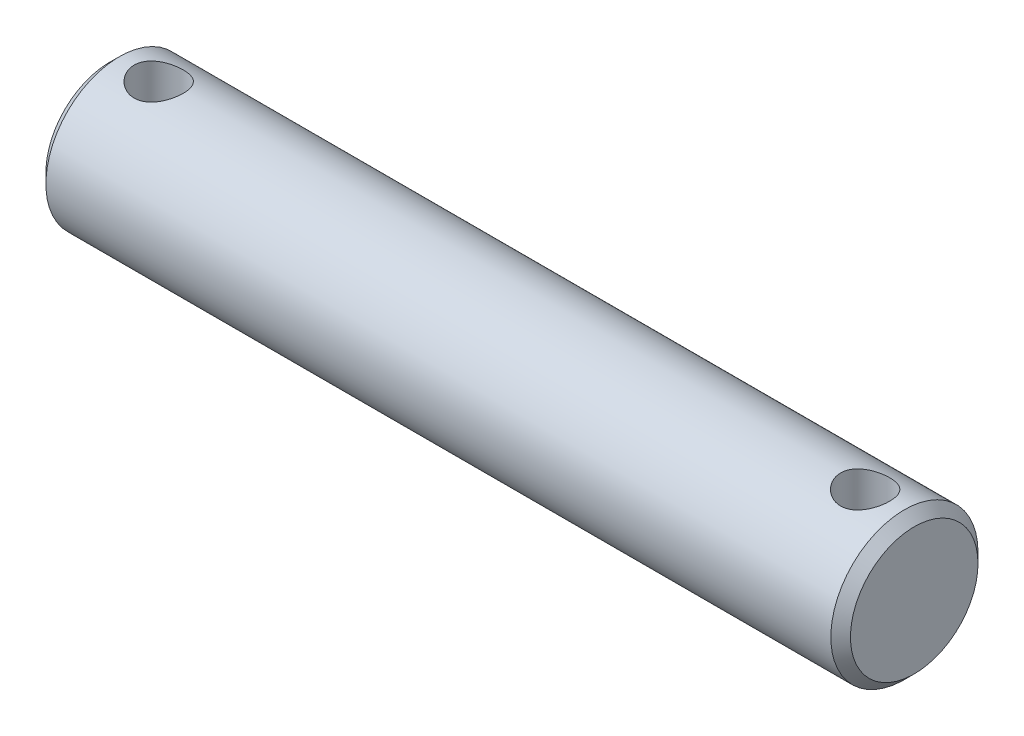
ISO-10303-21;
HEADER;
FILE_DESCRIPTION(('STEP AP214'),'2;1');
FILE_NAME('part.step','',(''),(''),'','','');
FILE_SCHEMA(('AUTOMOTIVE_DESIGN { 1 0 10303 214 1 1 1 1 }'));
ENDSEC;
DATA;
#1=APPLICATION_CONTEXT('core data for automotive mechanical design processes');
#2=APPLICATION_PROTOCOL_DEFINITION('international standard','automotive_design',2000,#1);
#3=PRODUCT_CONTEXT('',#1,'mechanical');
#4=PRODUCT('Part','Part','',(#3));
#5=PRODUCT_RELATED_PRODUCT_CATEGORY('part','',(#4));
#6=PRODUCT_DEFINITION_FORMATION('','',#4);
#7=PRODUCT_DEFINITION_CONTEXT('part definition',#1,'design');
#8=PRODUCT_DEFINITION('design','',#6,#7);
#9=PRODUCT_DEFINITION_SHAPE('','',#8);
#10=(LENGTH_UNIT() NAMED_UNIT(*) SI_UNIT(.MILLI.,.METRE.));
#11=(NAMED_UNIT(*) PLANE_ANGLE_UNIT() SI_UNIT($,.RADIAN.));
#12=(NAMED_UNIT(*) SI_UNIT($,.STERADIAN.) SOLID_ANGLE_UNIT());
#13=UNCERTAINTY_MEASURE_WITH_UNIT(LENGTH_MEASURE(1.E-05),#10,'distance_accuracy_value','');
#14=(GEOMETRIC_REPRESENTATION_CONTEXT(3) GLOBAL_UNCERTAINTY_ASSIGNED_CONTEXT((#13)) GLOBAL_UNIT_ASSIGNED_CONTEXT((#10,
#11,#12)) REPRESENTATION_CONTEXT('',''));
#15=CARTESIAN_POINT('',(0.,0.,0.));
#16=DIRECTION('',(0.,0.,1.));
#17=DIRECTION('',(1.,0.,0.));
#18=AXIS2_PLACEMENT_3D('',#15,#16,#17);
#19=CARTESIAN_POINT('',(-41.,0.,0.));
#20=DIRECTION('',(1.,0.,0.));
#21=DIRECTION('',(0.,0.,-1.));
#22=AXIS2_PLACEMENT_3D('',#19,#20,#21);
#23=CYLINDRICAL_SURFACE('',#22,7.5);
#24=CARTESIAN_POINT('',(40.,0.,0.));
#25=DIRECTION('',(1.,0.,0.));
#26=DIRECTION('',(0.,0.,-1.));
#27=AXIS2_PLACEMENT_3D('',#24,#25,#26);
#28=CIRCLE('',#27,7.5);
#29=CARTESIAN_POINT('',(40.,0.,-7.5));
#30=VERTEX_POINT('',#29);
#31=EDGE_CURVE('E38',#30,#30,#28,.F.);
#32=ORIENTED_EDGE('',*,*,#31,.T.);
#33=EDGE_LOOP('',(#32));
#34=FACE_BOUND('',#33,.T.);
#35=CARTESIAN_POINT('',(-40.,0.,0.));
#36=DIRECTION('',(1.,0.,0.));
#37=DIRECTION('',(0.,0.,-1.));
#38=AXIS2_PLACEMENT_3D('',#35,#36,#37);
#39=CIRCLE('',#38,7.5);
#40=CARTESIAN_POINT('',(-40.,0.,-7.5));
#41=VERTEX_POINT('',#40);
#42=EDGE_CURVE('E42',#41,#41,#39,.T.);
#43=ORIENTED_EDGE('',*,*,#42,.T.);
#44=EDGE_LOOP('',(#43));
#45=FACE_BOUND('',#44,.T.);
#46=CARTESIAN_POINT('',(36.,-7.07106781186547,2.5));
#47=CARTESIAN_POINT('',(36.1361704370902,-7.07106736326085,2.50000064486928));
#48=CARTESIAN_POINT('',(36.272336999559,-7.07504423227143,2.48883695921381));
#49=CARTESIAN_POINT('',(36.5406360524856,-7.09043935203137,2.44462782922202));
#50=CARTESIAN_POINT('',(36.6727678746812,-7.10185882855472,2.41157878042099));
#51=CARTESIAN_POINT('',(36.9290672324932,-7.13070509221979,2.32488871421226));
#52=CARTESIAN_POINT('',(37.0532498236068,-7.14812009928304,2.27128805350812));
#53=CARTESIAN_POINT('',(37.2909001213699,-7.18697805025812,2.14515407110345));
#54=CARTESIAN_POINT('',(37.4043654563841,-7.20842188259031,2.07261657215046));
#55=CARTESIAN_POINT('',(37.6217999058458,-7.25386223518683,1.9076278661072));
#56=CARTESIAN_POINT('',(37.7252885716793,-7.2779223711161,1.8145608534448));
#57=CARTESIAN_POINT('',(37.9155170030616,-7.32534662002507,1.61246916803599));
#58=CARTESIAN_POINT('',(38.0022540789559,-7.34871062072404,1.50344193763094));
#59=CARTESIAN_POINT('',(38.158697243324,-7.39284667304497,1.26901126991253));
#60=CARTESIAN_POINT('',(38.2278999265449,-7.41353519254014,1.14325477806131));
#61=CARTESIAN_POINT('',(38.3439789628188,-7.44923966927457,0.881078057468687));
#62=CARTESIAN_POINT('',(38.3908613329423,-7.46425715507505,0.744660714218033));
#63=CARTESIAN_POINT('',(38.459339636581,-7.48647688579767,0.470072043583739));
#64=CARTESIAN_POINT('',(38.4817586156425,-7.49393286943898,0.332126887132425));
#65=CARTESIAN_POINT('',(38.5032907334017,-7.5010902054562,0.0542446870602269));
#66=CARTESIAN_POINT('',(38.502409879131,-7.50079355657239,-0.085691833859738));
#67=CARTESIAN_POINT('',(38.4778893635849,-7.49265099046828,-0.357758787984534));
#68=CARTESIAN_POINT('',(38.4551436788138,-7.48510161887793,-0.489980121479139));
#69=CARTESIAN_POINT('',(38.3890175475488,-7.46367418349329,-0.748608597055427));
#70=CARTESIAN_POINT('',(38.3456357025504,-7.44979569077954,-0.875015344448038));
#71=CARTESIAN_POINT('',(38.2389467067349,-7.41689175733061,-1.12038118710493));
#72=CARTESIAN_POINT('',(38.1753851536337,-7.39780106310039,-1.23922055242211));
#73=CARTESIAN_POINT('',(38.0303507363784,-7.35645982597298,-1.46481081381831));
#74=CARTESIAN_POINT('',(37.9488728916809,-7.33420840503667,-1.57155833596335));
#75=CARTESIAN_POINT('',(37.7658140163508,-7.28765479624741,-1.77525216637827));
#76=CARTESIAN_POINT('',(37.6634671053963,-7.26330537922194,-1.87150039266318));
#77=CARTESIAN_POINT('',(37.4438781856835,-7.21618338122252,-2.04569314899543));
#78=CARTESIAN_POINT('',(37.3266338856799,-7.19341104364038,-2.12363485820386));
#79=CARTESIAN_POINT('',(37.0783659359914,-7.15176312802781,-2.25996863758936));
#80=CARTESIAN_POINT('',(36.9471696717056,-7.1329477321187,-2.31806615905335));
#81=CARTESIAN_POINT('',(36.676071514464,-7.10204127060962,-2.41110798317334));
#82=CARTESIAN_POINT('',(36.5361732969844,-7.08994738717732,-2.44606198936873));
#83=CARTESIAN_POINT('',(36.2584041114711,-7.07449090788963,-2.49040320524381));
#84=CARTESIAN_POINT('',(36.1207264381284,-7.0707590079689,-2.50087273876908));
#85=CARTESIAN_POINT('',(35.8455596272147,-7.07141680147961,-2.4990135972743));
#86=CARTESIAN_POINT('',(35.70807045994,-7.07580501979536,-2.48668906306691));
#87=CARTESIAN_POINT('',(35.4421075857202,-7.09184045225748,-2.44056412888078));
#88=CARTESIAN_POINT('',(35.3134864246229,-7.10323313602101,-2.40751598495171));
#89=CARTESIAN_POINT('',(35.063640984402,-7.13171384177557,-2.32178465640117));
#90=CARTESIAN_POINT('',(34.9424180210231,-7.14880287337099,-2.26909799090856));
#91=CARTESIAN_POINT('',(34.7065489478825,-7.18742193989467,-2.14368585184734));
#92=CARTESIAN_POINT('',(34.5922333933955,-7.20907564164071,-2.07037779589624));
#93=CARTESIAN_POINT('',(34.3771348690407,-7.25414421827413,-1.9064640763939));
#94=CARTESIAN_POINT('',(34.276355903347,-7.27755961109486,-1.81585331374696));
#95=CARTESIAN_POINT('',(34.0861800397734,-7.32487596594622,-1.61472926475082));
#96=CARTESIAN_POINT('',(33.9975640249529,-7.34874608944741,-1.50346817636663));
#97=CARTESIAN_POINT('',(33.8402096441299,-7.39317129032772,-1.26706822850065));
#98=CARTESIAN_POINT('',(33.7714705720939,-7.41372648544237,-1.14192986216138));
#99=CARTESIAN_POINT('',(33.6564497378457,-7.44911014526507,-0.881949656080743));
#100=CARTESIAN_POINT('',(33.6100218071298,-7.46397575011328,-0.747177808302994));
#101=CARTESIAN_POINT('',(33.5406806448497,-7.48646527094436,-0.471146164615044));
#102=CARTESIAN_POINT('',(33.5177589252988,-7.49409180085047,-0.329888729884728));
#103=CARTESIAN_POINT('',(33.4968448059859,-7.50104658090641,-0.0520383396501075));
#104=CARTESIAN_POINT('',(33.4977313651691,-7.50074800223598,0.0844618098000421));
#105=CARTESIAN_POINT('',(33.521643270366,-7.49280491298495,0.355277862500432));
#106=CARTESIAN_POINT('',(33.5446668203819,-7.48516099833939,0.489593942047639));
#107=CARTESIAN_POINT('',(33.6114555864399,-7.46352287386031,0.750105298580145));
#108=CARTESIAN_POINT('',(33.6548855383823,-7.44963145902871,0.876395677281971));
#109=CARTESIAN_POINT('',(33.7609438277429,-7.41692901761237,1.11994587734949));
#110=CARTESIAN_POINT('',(33.8235756379925,-7.39811710120041,1.23720406035608));
#111=CARTESIAN_POINT('',(33.968923780255,-7.35664672069702,1.46408504077196));
#112=CARTESIAN_POINT('',(34.0522967134541,-7.33387181229816,1.57326562889402));
#113=CARTESIAN_POINT('',(34.2356434778905,-7.28732471979699,1.77645256568107));
#114=CARTESIAN_POINT('',(34.3356226056568,-7.26355221932743,1.87045405406148));
#115=CARTESIAN_POINT('',(34.5540233889674,-7.21658199563995,2.04435452208279));
#116=CARTESIAN_POINT('',(34.6730137774416,-7.19344319971577,2.12355741499475));
#117=CARTESIAN_POINT('',(34.9233360672569,-7.15150483307538,2.26078585825279));
#118=CARTESIAN_POINT('',(35.0546647325742,-7.13270412903123,2.31881694204869));
#119=CARTESIAN_POINT('',(35.3199045600391,-7.10253335516286,2.40960957051041));
#120=CARTESIAN_POINT('',(35.4534306588134,-7.09086582142956,2.4433947728738));
#121=CARTESIAN_POINT('',(35.7246401261668,-7.07513458848795,2.48858580037317));
#122=CARTESIAN_POINT('',(35.8623220435268,-7.07106826543653,2.49999934799148));
#123=CARTESIAN_POINT('',(36.,-7.07106781186547,2.5));
#124=B_SPLINE_CURVE_WITH_KNOTS('',3,(#46,#47,#48,#49,#50,#51,#52,#53,#54,#55,#56,#57,#58,#59,
#60,#61,#62,#63,#64,#65,#66,#67,#68,#69,#70,#71,#72,#73,#74,#75,#76,#77,#78,#79,#80,#81,#82,#83,
#84,#85,#86,#87,#88,#89,#90,#91,#92,#93,#94,#95,#96,#97,#98,#99,#100,#101,#102,#103,#104,#105,
#106,#107,#108,#109,#110,#111,#112,#113,#114,#115,#116,#117,#118,#119,#120,#121,#122,#123),
.UNSPECIFIED.,.T.,.F.,(4,2,2,2,2,2,2,2,2,2,2,2,2,2,2,2,2,2,2,2,2,2,2,2,2,2,2,2,2,2,2,2,2,2,2,2,
2,2,4),(0.,0.408001461998397,0.816070137537908,1.22334156875207,1.6307029154636,2.0525334356892,
2.4744316292997,2.90733765359143,3.34012690966972,3.75785796912336,4.17548133255818,
4.57672512063923,4.97799610473092,5.38454137150838,5.79119979685055,6.21700435909794,
6.64287449030265,7.07481599607639,7.50657628391539,7.91885728411098,8.33106339593085,
8.72910989421941,9.12722697867365,9.53797144339288,9.94883714155319,10.3794702042773,
10.8100879689383,11.2378447797713,11.6654470751039,12.0729521169409,12.4804241002445,
12.8814239010108,13.2824962690811,13.6983879880159,14.1144126108158,14.5467225684036,
14.9789194566717,15.3915803040673,15.8040986797616),.UNSPECIFIED.);
#125=CARTESIAN_POINT('',(36.,-7.07106781186547,2.5));
#126=VERTEX_POINT('',#125);
#127=EDGE_CURVE('E84',#126,#126,#124,.T.);
#128=ORIENTED_EDGE('',*,*,#127,.T.);
#129=EDGE_LOOP('',(#128));
#130=FACE_BOUND('',#129,.T.);
#131=CARTESIAN_POINT('',(-36.,-7.07106781186547,2.5));
#132=CARTESIAN_POINT('',(-35.8638295629098,-7.07106736326085,2.50000064486928));
#133=CARTESIAN_POINT('',(-35.727663000441,-7.07504423227143,2.48883695921381));
#134=CARTESIAN_POINT('',(-35.4593639475144,-7.09043935203137,2.44462782922202));
#135=CARTESIAN_POINT('',(-35.3272321253188,-7.10185882855472,2.41157878042099));
#136=CARTESIAN_POINT('',(-35.0709327675068,-7.13070509221979,2.32488871421226));
#137=CARTESIAN_POINT('',(-34.9467501763932,-7.14812009928304,2.27128805350812));
#138=CARTESIAN_POINT('',(-34.7090998786301,-7.18697805025812,2.14515407110345));
#139=CARTESIAN_POINT('',(-34.5956345436159,-7.20842188259031,2.07261657215046));
#140=CARTESIAN_POINT('',(-34.3782000941542,-7.25386223518683,1.9076278661072));
#141=CARTESIAN_POINT('',(-34.2747114283207,-7.2779223711161,1.8145608534448));
#142=CARTESIAN_POINT('',(-34.0844829969384,-7.32534662002507,1.61246916803599));
#143=CARTESIAN_POINT('',(-33.9977459210441,-7.34871062072404,1.50344193763094));
#144=CARTESIAN_POINT('',(-33.841302756676,-7.39284667304497,1.26901126991253));
#145=CARTESIAN_POINT('',(-33.7721000734551,-7.41353519254014,1.14325477806131));
#146=CARTESIAN_POINT('',(-33.6560210371812,-7.44923966927457,0.881078057468687));
#147=CARTESIAN_POINT('',(-33.6091386670577,-7.46425715507505,0.744660714218033));
#148=CARTESIAN_POINT('',(-33.540660363419,-7.48647688579767,0.470072043583739));
#149=CARTESIAN_POINT('',(-33.5182413843575,-7.49393286943898,0.332126887132425));
#150=CARTESIAN_POINT('',(-33.4967092665984,-7.5010902054562,0.0542446870602269));
#151=CARTESIAN_POINT('',(-33.497590120869,-7.50079355657239,-0.085691833859738));
#152=CARTESIAN_POINT('',(-33.5221106364151,-7.49265099046828,-0.357758787984534));
#153=CARTESIAN_POINT('',(-33.5448563211862,-7.48510161887793,-0.489980121479139));
#154=CARTESIAN_POINT('',(-33.6109824524512,-7.46367418349329,-0.748608597055427));
#155=CARTESIAN_POINT('',(-33.6543642974496,-7.44979569077954,-0.875015344448038));
#156=CARTESIAN_POINT('',(-33.7610532932651,-7.41689175733061,-1.12038118710493));
#157=CARTESIAN_POINT('',(-33.8246148463663,-7.39780106310039,-1.23922055242211));
#158=CARTESIAN_POINT('',(-33.9696492636216,-7.35645982597298,-1.46481081381831));
#159=CARTESIAN_POINT('',(-34.0511271083191,-7.33420840503667,-1.57155833596335));
#160=CARTESIAN_POINT('',(-34.2341859836492,-7.28765479624741,-1.77525216637827));
#161=CARTESIAN_POINT('',(-34.3365328946037,-7.26330537922194,-1.87150039266318));
#162=CARTESIAN_POINT('',(-34.5561218143165,-7.21618338122252,-2.04569314899543));
#163=CARTESIAN_POINT('',(-34.6733661143201,-7.19341104364038,-2.12363485820386));
#164=CARTESIAN_POINT('',(-34.9216340640086,-7.15176312802781,-2.25996863758936));
#165=CARTESIAN_POINT('',(-35.0528303282944,-7.1329477321187,-2.31806615905335));
#166=CARTESIAN_POINT('',(-35.323928485536,-7.10204127060962,-2.41110798317334));
#167=CARTESIAN_POINT('',(-35.4638267030156,-7.08994738717732,-2.44606198936873));
#168=CARTESIAN_POINT('',(-35.7415958885289,-7.07449090788963,-2.49040320524381));
#169=CARTESIAN_POINT('',(-35.8792735618716,-7.0707590079689,-2.50087273876908));
#170=CARTESIAN_POINT('',(-36.1544403727853,-7.07141680147961,-2.4990135972743));
#171=CARTESIAN_POINT('',(-36.29192954006,-7.07580501979536,-2.48668906306691));
#172=CARTESIAN_POINT('',(-36.5578924142798,-7.09184045225748,-2.44056412888078));
#173=CARTESIAN_POINT('',(-36.6865135753771,-7.10323313602101,-2.40751598495171));
#174=CARTESIAN_POINT('',(-36.936359015598,-7.13171384177557,-2.32178465640117));
#175=CARTESIAN_POINT('',(-37.057581978977,-7.14880287337099,-2.26909799090856));
#176=CARTESIAN_POINT('',(-37.2934510521175,-7.18742193989467,-2.14368585184734));
#177=CARTESIAN_POINT('',(-37.4077666066045,-7.20907564164071,-2.07037779589624));
#178=CARTESIAN_POINT('',(-37.6228651309593,-7.25414421827413,-1.9064640763939));
#179=CARTESIAN_POINT('',(-37.7236440966531,-7.27755961109486,-1.81585331374696));
#180=CARTESIAN_POINT('',(-37.9138199602266,-7.32487596594622,-1.61472926475082));
#181=CARTESIAN_POINT('',(-38.0024359750471,-7.34874608944741,-1.50346817636663));
#182=CARTESIAN_POINT('',(-38.1597903558701,-7.39317129032772,-1.26706822850065));
#183=CARTESIAN_POINT('',(-38.2285294279061,-7.41372648544237,-1.14192986216138));
#184=CARTESIAN_POINT('',(-38.3435502621543,-7.44911014526507,-0.881949656080743));
#185=CARTESIAN_POINT('',(-38.3899781928702,-7.46397575011328,-0.747177808302994));
#186=CARTESIAN_POINT('',(-38.4593193551503,-7.48646527094436,-0.471146164615044));
#187=CARTESIAN_POINT('',(-38.4822410747013,-7.49409180085047,-0.329888729884728));
#188=CARTESIAN_POINT('',(-38.5031551940141,-7.50104658090641,-0.0520383396501077));
#189=CARTESIAN_POINT('',(-38.5022686348309,-7.50074800223598,0.0844618098000418));
#190=CARTESIAN_POINT('',(-38.478356729634,-7.49280491298495,0.355277862500431));
#191=CARTESIAN_POINT('',(-38.4553331796181,-7.48516099833939,0.489593942047639));
#192=CARTESIAN_POINT('',(-38.3885444135601,-7.46352287386031,0.750105298580145));
#193=CARTESIAN_POINT('',(-38.3451144616177,-7.44963145902871,0.876395677281971));
#194=CARTESIAN_POINT('',(-38.2390561722571,-7.41692901761237,1.11994587734949));
#195=CARTESIAN_POINT('',(-38.1764243620075,-7.39811710120041,1.23720406035608));
#196=CARTESIAN_POINT('',(-38.031076219745,-7.35664672069702,1.46408504077196));
#197=CARTESIAN_POINT('',(-37.9477032865459,-7.33387181229816,1.57326562889402));
#198=CARTESIAN_POINT('',(-37.7643565221095,-7.28732471979699,1.77645256568107));
#199=CARTESIAN_POINT('',(-37.6643773943432,-7.26355221932743,1.87045405406148));
#200=CARTESIAN_POINT('',(-37.4459766110326,-7.21658199563995,2.0443545220828));
#201=CARTESIAN_POINT('',(-37.3269862225584,-7.19344319971577,2.12355741499475));
#202=CARTESIAN_POINT('',(-37.0766639327431,-7.15150483307538,2.26078585825279));
#203=CARTESIAN_POINT('',(-36.9453352674258,-7.13270412903123,2.31881694204869));
#204=CARTESIAN_POINT('',(-36.6800954399609,-7.10253335516286,2.40960957051042));
#205=CARTESIAN_POINT('',(-36.5465693411866,-7.09086582142956,2.4433947728738));
#206=CARTESIAN_POINT('',(-36.2753598738333,-7.07513458848795,2.48858580037317));
#207=CARTESIAN_POINT('',(-36.1376779564732,-7.07106826543653,2.49999934799148));
#208=CARTESIAN_POINT('',(-36.,-7.07106781186547,2.5));
#209=B_SPLINE_CURVE_WITH_KNOTS('',3,(#131,#132,#133,#134,#135,#136,#137,#138,#139,#140,#141,
#142,#143,#144,#145,#146,#147,#148,#149,#150,#151,#152,#153,#154,#155,#156,#157,#158,#159,#160,
#161,#162,#163,#164,#165,#166,#167,#168,#169,#170,#171,#172,#173,#174,#175,#176,#177,#178,#179,
#180,#181,#182,#183,#184,#185,#186,#187,#188,#189,#190,#191,#192,#193,#194,#195,#196,#197,#198,
#199,#200,#201,#202,#203,#204,#205,#206,#207,#208),.UNSPECIFIED.,.T.,.F.,(4,2,2,2,2,2,2,2,2,2,2,
2,2,2,2,2,2,2,2,2,2,2,2,2,2,2,2,2,2,2,2,2,2,2,2,2,2,2,4),(0.,0.408001461998397,
0.816070137537908,1.22334156875207,1.6307029154636,2.0525334356892,2.4744316292997,
2.90733765359143,3.34012690966972,3.75785796912336,4.17548133255818,4.57672512063923,
4.97799610473092,5.38454137150838,5.79119979685055,6.21700435909794,6.64287449030265,
7.07481599607639,7.50657628391539,7.91885728411099,8.33106339593085,8.72910989421941,
9.12722697867365,9.53797144339288,9.94883714155319,10.3794702042773,10.8100879689383,
11.2378447797713,11.6654470751039,12.0729521169409,12.4804241002445,12.8814239010108,
13.2824962690811,13.6983879880159,14.1144126108158,14.5467225684036,14.9789194566717,
15.3915803040673,15.8040986797616),.UNSPECIFIED.);
#210=CARTESIAN_POINT('',(-36.,-7.07106781186547,2.5));
#211=VERTEX_POINT('',#210);
#212=EDGE_CURVE('E58',#211,#211,#209,.T.);
#213=ORIENTED_EDGE('',*,*,#212,.T.);
#214=EDGE_LOOP('',(#213));
#215=FACE_BOUND('',#214,.T.);
#216=CARTESIAN_POINT('',(-36.,7.07106781186547,-2.5));
#217=CARTESIAN_POINT('',(-36.1361704370902,7.07106736326085,-2.50000064486928));
#218=CARTESIAN_POINT('',(-36.272336999559,7.07504423227143,-2.48883695921381));
#219=CARTESIAN_POINT('',(-36.5406360524856,7.09043935203137,-2.44462782922202));
#220=CARTESIAN_POINT('',(-36.6727678746812,7.10185882855472,-2.41157878042099));
#221=CARTESIAN_POINT('',(-36.9290672324932,7.13070509221979,-2.32488871421226));
#222=CARTESIAN_POINT('',(-37.0532498236068,7.14812009928304,-2.27128805350812));
#223=CARTESIAN_POINT('',(-37.2909001213699,7.18697805025812,-2.14515407110345));
#224=CARTESIAN_POINT('',(-37.4043654563841,7.20842188259031,-2.07261657215046));
#225=CARTESIAN_POINT('',(-37.6217999058458,7.25386223518683,-1.9076278661072));
#226=CARTESIAN_POINT('',(-37.7252885716793,7.2779223711161,-1.8145608534448));
#227=CARTESIAN_POINT('',(-37.9155170030616,7.32534662002507,-1.61246916803599));
#228=CARTESIAN_POINT('',(-38.0022540789559,7.34871062072404,-1.50344193763094));
#229=CARTESIAN_POINT('',(-38.158697243324,7.39284667304497,-1.26901126991253));
#230=CARTESIAN_POINT('',(-38.2278999265449,7.41353519254014,-1.14325477806131));
#231=CARTESIAN_POINT('',(-38.3439789628188,7.44923966927457,-0.881078057468687));
#232=CARTESIAN_POINT('',(-38.3908613329423,7.46425715507505,-0.744660714218033));
#233=CARTESIAN_POINT('',(-38.459339636581,7.48647688579767,-0.470072043583739));
#234=CARTESIAN_POINT('',(-38.4817586156425,7.49393286943898,-0.332126887132425));
#235=CARTESIAN_POINT('',(-38.5032907334017,7.5010902054562,-0.0542446870602269));
#236=CARTESIAN_POINT('',(-38.502409879131,7.50079355657239,0.085691833859738));
#237=CARTESIAN_POINT('',(-38.4778893635849,7.49265099046828,0.357758787984534));
#238=CARTESIAN_POINT('',(-38.4551436788138,7.48510161887793,0.489980121479139));
#239=CARTESIAN_POINT('',(-38.3890175475488,7.46367418349329,0.748608597055427));
#240=CARTESIAN_POINT('',(-38.3456357025504,7.44979569077954,0.875015344448038));
#241=CARTESIAN_POINT('',(-38.2389467067349,7.41689175733061,1.12038118710493));
#242=CARTESIAN_POINT('',(-38.1753851536337,7.39780106310039,1.23922055242211));
#243=CARTESIAN_POINT('',(-38.0303507363784,7.35645982597298,1.46481081381831));
#244=CARTESIAN_POINT('',(-37.9488728916809,7.33420840503667,1.57155833596335));
#245=CARTESIAN_POINT('',(-37.7658140163508,7.28765479624741,1.77525216637827));
#246=CARTESIAN_POINT('',(-37.6634671053963,7.26330537922194,1.87150039266318));
#247=CARTESIAN_POINT('',(-37.4438781856835,7.21618338122252,2.04569314899543));
#248=CARTESIAN_POINT('',(-37.3266338856799,7.19341104364038,2.12363485820386));
#249=CARTESIAN_POINT('',(-37.0783659359914,7.15176312802781,2.25996863758936));
#250=CARTESIAN_POINT('',(-36.9471696717056,7.1329477321187,2.31806615905335));
#251=CARTESIAN_POINT('',(-36.676071514464,7.10204127060962,2.41110798317334));
#252=CARTESIAN_POINT('',(-36.5361732969844,7.08994738717732,2.44606198936873));
#253=CARTESIAN_POINT('',(-36.2584041114711,7.07449090788963,2.49040320524381));
#254=CARTESIAN_POINT('',(-36.1207264381284,7.0707590079689,2.50087273876908));
#255=CARTESIAN_POINT('',(-35.8455596272147,7.07141680147961,2.4990135972743));
#256=CARTESIAN_POINT('',(-35.70807045994,7.07580501979536,2.48668906306691));
#257=CARTESIAN_POINT('',(-35.4421075857202,7.09184045225748,2.44056412888078));
#258=CARTESIAN_POINT('',(-35.3134864246229,7.10323313602101,2.40751598495171));
#259=CARTESIAN_POINT('',(-35.063640984402,7.13171384177557,2.32178465640117));
#260=CARTESIAN_POINT('',(-34.9424180210231,7.14880287337099,2.26909799090856));
#261=CARTESIAN_POINT('',(-34.7065489478825,7.18742193989467,2.14368585184734));
#262=CARTESIAN_POINT('',(-34.5922333933955,7.20907564164071,2.07037779589624));
#263=CARTESIAN_POINT('',(-34.3771348690407,7.25414421827413,1.9064640763939));
#264=CARTESIAN_POINT('',(-34.276355903347,7.27755961109486,1.81585331374696));
#265=CARTESIAN_POINT('',(-34.0861800397734,7.32487596594622,1.61472926475082));
#266=CARTESIAN_POINT('',(-33.9975640249529,7.34874608944741,1.50346817636663));
#267=CARTESIAN_POINT('',(-33.8402096441299,7.39317129032772,1.26706822850065));
#268=CARTESIAN_POINT('',(-33.7714705720939,7.41372648544237,1.14192986216138));
#269=CARTESIAN_POINT('',(-33.6564497378457,7.44911014526507,0.881949656080743));
#270=CARTESIAN_POINT('',(-33.6100218071298,7.46397575011328,0.747177808302994));
#271=CARTESIAN_POINT('',(-33.5406806448497,7.48646527094436,0.471146164615044));
#272=CARTESIAN_POINT('',(-33.5177589252988,7.49409180085047,0.329888729884728));
#273=CARTESIAN_POINT('',(-33.4968448059859,7.50104658090641,0.0520383396501075));
#274=CARTESIAN_POINT('',(-33.4977313651691,7.50074800223598,-0.0844618098000421));
#275=CARTESIAN_POINT('',(-33.521643270366,7.49280491298495,-0.355277862500432));
#276=CARTESIAN_POINT('',(-33.5446668203819,7.48516099833939,-0.489593942047639));
#277=CARTESIAN_POINT('',(-33.6114555864399,7.46352287386031,-0.750105298580145));
#278=CARTESIAN_POINT('',(-33.6548855383823,7.44963145902871,-0.876395677281971));
#279=CARTESIAN_POINT('',(-33.7609438277429,7.41692901761237,-1.11994587734949));
#280=CARTESIAN_POINT('',(-33.8235756379925,7.39811710120041,-1.23720406035608));
#281=CARTESIAN_POINT('',(-33.968923780255,7.35664672069702,-1.46408504077196));
#282=CARTESIAN_POINT('',(-34.0522967134541,7.33387181229816,-1.57326562889402));
#283=CARTESIAN_POINT('',(-34.2356434778905,7.28732471979699,-1.77645256568107));
#284=CARTESIAN_POINT('',(-34.3356226056568,7.26355221932743,-1.87045405406148));
#285=CARTESIAN_POINT('',(-34.5540233889674,7.21658199563995,-2.04435452208279));
#286=CARTESIAN_POINT('',(-34.6730137774416,7.19344319971577,-2.12355741499475));
#287=CARTESIAN_POINT('',(-34.9233360672569,7.15150483307538,-2.26078585825279));
#288=CARTESIAN_POINT('',(-35.0546647325742,7.13270412903123,-2.31881694204869));
#289=CARTESIAN_POINT('',(-35.3199045600391,7.10253335516286,-2.40960957051041));
#290=CARTESIAN_POINT('',(-35.4534306588134,7.09086582142956,-2.4433947728738));
#291=CARTESIAN_POINT('',(-35.7246401261668,7.07513458848795,-2.48858580037317));
#292=CARTESIAN_POINT('',(-35.8623220435268,7.07106826543653,-2.49999934799148));
#293=CARTESIAN_POINT('',(-36.,7.07106781186547,-2.5));
#294=B_SPLINE_CURVE_WITH_KNOTS('',3,(#216,#217,#218,#219,#220,#221,#222,#223,#224,#225,#226,
#227,#228,#229,#230,#231,#232,#233,#234,#235,#236,#237,#238,#239,#240,#241,#242,#243,#244,#245,
#246,#247,#248,#249,#250,#251,#252,#253,#254,#255,#256,#257,#258,#259,#260,#261,#262,#263,#264,
#265,#266,#267,#268,#269,#270,#271,#272,#273,#274,#275,#276,#277,#278,#279,#280,#281,#282,#283,
#284,#285,#286,#287,#288,#289,#290,#291,#292,#293),.UNSPECIFIED.,.T.,.F.,(4,2,2,2,2,2,2,2,2,2,2,
2,2,2,2,2,2,2,2,2,2,2,2,2,2,2,2,2,2,2,2,2,2,2,2,2,2,2,4),(0.,0.408001461998397,
0.816070137537908,1.22334156875207,1.6307029154636,2.0525334356892,2.4744316292997,
2.90733765359143,3.34012690966972,3.75785796912336,4.17548133255818,4.57672512063923,
4.97799610473092,5.38454137150838,5.79119979685055,6.21700435909794,6.64287449030265,
7.07481599607639,7.50657628391539,7.91885728411098,8.33106339593085,8.72910989421941,
9.12722697867365,9.53797144339288,9.94883714155319,10.3794702042773,10.8100879689383,
11.2378447797713,11.6654470751039,12.0729521169409,12.4804241002445,12.8814239010108,
13.2824962690811,13.6983879880159,14.1144126108158,14.5467225684036,14.9789194566717,
15.3915803040673,15.8040986797616),.UNSPECIFIED.);
#295=CARTESIAN_POINT('',(-36.,7.07106781186547,-2.5));
#296=VERTEX_POINT('',#295);
#297=EDGE_CURVE('E51',#296,#296,#294,.T.);
#298=ORIENTED_EDGE('',*,*,#297,.F.);
#299=EDGE_LOOP('',(#298));
#300=FACE_BOUND('',#299,.T.);
#301=CARTESIAN_POINT('',(36.,7.07106781186547,-2.5));
#302=CARTESIAN_POINT('',(35.8638295629098,7.07106736326085,-2.50000064486928));
#303=CARTESIAN_POINT('',(35.727663000441,7.07504423227143,-2.48883695921381));
#304=CARTESIAN_POINT('',(35.4593639475144,7.09043935203137,-2.44462782922202));
#305=CARTESIAN_POINT('',(35.3272321253188,7.10185882855472,-2.41157878042099));
#306=CARTESIAN_POINT('',(35.0709327675068,7.13070509221979,-2.32488871421226));
#307=CARTESIAN_POINT('',(34.9467501763932,7.14812009928304,-2.27128805350812));
#308=CARTESIAN_POINT('',(34.7090998786301,7.18697805025812,-2.14515407110345));
#309=CARTESIAN_POINT('',(34.5956345436159,7.20842188259031,-2.07261657215046));
#310=CARTESIAN_POINT('',(34.3782000941542,7.25386223518683,-1.9076278661072));
#311=CARTESIAN_POINT('',(34.2747114283207,7.2779223711161,-1.8145608534448));
#312=CARTESIAN_POINT('',(34.0844829969384,7.32534662002507,-1.61246916803599));
#313=CARTESIAN_POINT('',(33.9977459210441,7.34871062072404,-1.50344193763094));
#314=CARTESIAN_POINT('',(33.841302756676,7.39284667304497,-1.26901126991253));
#315=CARTESIAN_POINT('',(33.7721000734551,7.41353519254014,-1.14325477806131));
#316=CARTESIAN_POINT('',(33.6560210371812,7.44923966927457,-0.881078057468687));
#317=CARTESIAN_POINT('',(33.6091386670577,7.46425715507505,-0.744660714218033));
#318=CARTESIAN_POINT('',(33.540660363419,7.48647688579767,-0.470072043583739));
#319=CARTESIAN_POINT('',(33.5182413843575,7.49393286943898,-0.332126887132425));
#320=CARTESIAN_POINT('',(33.4967092665984,7.5010902054562,-0.0542446870602269));
#321=CARTESIAN_POINT('',(33.497590120869,7.50079355657239,0.085691833859738));
#322=CARTESIAN_POINT('',(33.5221106364151,7.49265099046828,0.357758787984534));
#323=CARTESIAN_POINT('',(33.5448563211862,7.48510161887793,0.489980121479139));
#324=CARTESIAN_POINT('',(33.6109824524512,7.46367418349329,0.748608597055427));
#325=CARTESIAN_POINT('',(33.6543642974496,7.44979569077954,0.875015344448038));
#326=CARTESIAN_POINT('',(33.7610532932651,7.41689175733061,1.12038118710493));
#327=CARTESIAN_POINT('',(33.8246148463663,7.39780106310039,1.23922055242211));
#328=CARTESIAN_POINT('',(33.9696492636216,7.35645982597298,1.46481081381831));
#329=CARTESIAN_POINT('',(34.0511271083191,7.33420840503667,1.57155833596335));
#330=CARTESIAN_POINT('',(34.2341859836492,7.28765479624741,1.77525216637827));
#331=CARTESIAN_POINT('',(34.3365328946037,7.26330537922194,1.87150039266318));
#332=CARTESIAN_POINT('',(34.5561218143165,7.21618338122252,2.04569314899543));
#333=CARTESIAN_POINT('',(34.6733661143201,7.19341104364038,2.12363485820386));
#334=CARTESIAN_POINT('',(34.9216340640086,7.15176312802781,2.25996863758936));
#335=CARTESIAN_POINT('',(35.0528303282944,7.1329477321187,2.31806615905335));
#336=CARTESIAN_POINT('',(35.323928485536,7.10204127060962,2.41110798317334));
#337=CARTESIAN_POINT('',(35.4638267030156,7.08994738717732,2.44606198936873));
#338=CARTESIAN_POINT('',(35.7415958885289,7.07449090788963,2.49040320524381));
#339=CARTESIAN_POINT('',(35.8792735618716,7.0707590079689,2.50087273876908));
#340=CARTESIAN_POINT('',(36.1544403727853,7.07141680147961,2.4990135972743));
#341=CARTESIAN_POINT('',(36.29192954006,7.07580501979536,2.48668906306691));
#342=CARTESIAN_POINT('',(36.5578924142798,7.09184045225748,2.44056412888078));
#343=CARTESIAN_POINT('',(36.6865135753771,7.10323313602101,2.40751598495171));
#344=CARTESIAN_POINT('',(36.936359015598,7.13171384177557,2.32178465640117));
#345=CARTESIAN_POINT('',(37.057581978977,7.14880287337099,2.26909799090856));
#346=CARTESIAN_POINT('',(37.2934510521175,7.18742193989467,2.14368585184734));
#347=CARTESIAN_POINT('',(37.4077666066045,7.20907564164071,2.07037779589624));
#348=CARTESIAN_POINT('',(37.6228651309593,7.25414421827413,1.9064640763939));
#349=CARTESIAN_POINT('',(37.7236440966531,7.27755961109486,1.81585331374696));
#350=CARTESIAN_POINT('',(37.9138199602266,7.32487596594622,1.61472926475082));
#351=CARTESIAN_POINT('',(38.0024359750471,7.34874608944741,1.50346817636663));
#352=CARTESIAN_POINT('',(38.1597903558701,7.39317129032772,1.26706822850065));
#353=CARTESIAN_POINT('',(38.2285294279061,7.41372648544237,1.14192986216138));
#354=CARTESIAN_POINT('',(38.3435502621543,7.44911014526507,0.881949656080743));
#355=CARTESIAN_POINT('',(38.3899781928702,7.46397575011328,0.747177808302994));
#356=CARTESIAN_POINT('',(38.4593193551503,7.48646527094436,0.471146164615044));
#357=CARTESIAN_POINT('',(38.4822410747013,7.49409180085047,0.329888729884728));
#358=CARTESIAN_POINT('',(38.5031551940141,7.50104658090641,0.0520383396501077));
#359=CARTESIAN_POINT('',(38.5022686348309,7.50074800223598,-0.0844618098000418));
#360=CARTESIAN_POINT('',(38.478356729634,7.49280491298495,-0.355277862500431));
#361=CARTESIAN_POINT('',(38.4553331796181,7.48516099833939,-0.489593942047639));
#362=CARTESIAN_POINT('',(38.3885444135601,7.46352287386031,-0.750105298580145));
#363=CARTESIAN_POINT('',(38.3451144616177,7.44963145902871,-0.876395677281971));
#364=CARTESIAN_POINT('',(38.2390561722571,7.41692901761237,-1.11994587734949));
#365=CARTESIAN_POINT('',(38.1764243620075,7.39811710120041,-1.23720406035608));
#366=CARTESIAN_POINT('',(38.031076219745,7.35664672069702,-1.46408504077196));
#367=CARTESIAN_POINT('',(37.9477032865459,7.33387181229816,-1.57326562889402));
#368=CARTESIAN_POINT('',(37.7643565221095,7.28732471979699,-1.77645256568107));
#369=CARTESIAN_POINT('',(37.6643773943432,7.26355221932743,-1.87045405406148));
#370=CARTESIAN_POINT('',(37.4459766110326,7.21658199563995,-2.0443545220828));
#371=CARTESIAN_POINT('',(37.3269862225584,7.19344319971577,-2.12355741499475));
#372=CARTESIAN_POINT('',(37.0766639327431,7.15150483307538,-2.26078585825279));
#373=CARTESIAN_POINT('',(36.9453352674258,7.13270412903123,-2.31881694204869));
#374=CARTESIAN_POINT('',(36.6800954399609,7.10253335516286,-2.40960957051042));
#375=CARTESIAN_POINT('',(36.5465693411866,7.09086582142956,-2.4433947728738));
#376=CARTESIAN_POINT('',(36.2753598738333,7.07513458848795,-2.48858580037317));
#377=CARTESIAN_POINT('',(36.1376779564732,7.07106826543653,-2.49999934799148));
#378=CARTESIAN_POINT('',(36.,7.07106781186547,-2.5));
#379=B_SPLINE_CURVE_WITH_KNOTS('',3,(#301,#302,#303,#304,#305,#306,#307,#308,#309,#310,#311,
#312,#313,#314,#315,#316,#317,#318,#319,#320,#321,#322,#323,#324,#325,#326,#327,#328,#329,#330,
#331,#332,#333,#334,#335,#336,#337,#338,#339,#340,#341,#342,#343,#344,#345,#346,#347,#348,#349,
#350,#351,#352,#353,#354,#355,#356,#357,#358,#359,#360,#361,#362,#363,#364,#365,#366,#367,#368,
#369,#370,#371,#372,#373,#374,#375,#376,#377,#378),.UNSPECIFIED.,.T.,.F.,(4,2,2,2,2,2,2,2,2,2,2,
2,2,2,2,2,2,2,2,2,2,2,2,2,2,2,2,2,2,2,2,2,2,2,2,2,2,2,4),(0.,0.408001461998397,
0.816070137537908,1.22334156875207,1.6307029154636,2.0525334356892,2.4744316292997,
2.90733765359143,3.34012690966972,3.75785796912336,4.17548133255818,4.57672512063923,
4.97799610473092,5.38454137150838,5.79119979685055,6.21700435909794,6.64287449030265,
7.07481599607639,7.50657628391539,7.91885728411099,8.33106339593085,8.72910989421941,
9.12722697867365,9.53797144339288,9.94883714155319,10.3794702042773,10.8100879689383,
11.2378447797713,11.6654470751039,12.0729521169409,12.4804241002445,12.8814239010108,
13.2824962690811,13.6983879880159,14.1144126108158,14.5467225684036,14.9789194566717,
15.3915803040673,15.8040986797616),.UNSPECIFIED.);
#380=CARTESIAN_POINT('',(36.,7.07106781186547,-2.5));
#381=VERTEX_POINT('',#380);
#382=EDGE_CURVE('E79',#381,#381,#379,.T.);
#383=ORIENTED_EDGE('',*,*,#382,.F.);
#384=EDGE_LOOP('',(#383));
#385=FACE_BOUND('',#384,.T.);
#386=ADVANCED_FACE('F31',(#34,#45,#130,#215,#300,#385),#23,.T.);
#387=CARTESIAN_POINT('',(-41.,0.,0.));
#388=DIRECTION('',(1.,0.,0.));
#389=DIRECTION('',(0.,0.,-1.));
#390=AXIS2_PLACEMENT_3D('',#387,#388,#389);
#391=PLANE('',#390);
#392=CARTESIAN_POINT('',(-41.,0.,0.));
#393=DIRECTION('',(1.,0.,0.));
#394=DIRECTION('',(0.,0.,-1.));
#395=AXIS2_PLACEMENT_3D('',#392,#393,#394);
#396=CIRCLE('',#395,6.49999999999999);
#397=CARTESIAN_POINT('',(-41.,0.,-6.49999999999999));
#398=VERTEX_POINT('',#397);
#399=EDGE_CURVE('E10',#398,#398,#396,.F.);
#400=ORIENTED_EDGE('',*,*,#399,.T.);
#401=EDGE_LOOP('',(#400));
#402=FACE_BOUND('',#401,.T.);
#403=ADVANCED_FACE('F96',(#402),#391,.F.);
#404=CARTESIAN_POINT('',(41.,0.,0.));
#405=DIRECTION('',(1.,0.,0.));
#406=DIRECTION('',(0.,0.,-1.));
#407=AXIS2_PLACEMENT_3D('',#404,#405,#406);
#408=PLANE('',#407);
#409=CARTESIAN_POINT('',(41.,0.,0.));
#410=DIRECTION('',(1.,0.,0.));
#411=DIRECTION('',(0.,0.,-1.));
#412=AXIS2_PLACEMENT_3D('',#409,#410,#411);
#413=CIRCLE('',#412,6.50000000000001);
#414=CARTESIAN_POINT('',(41.,0.,-6.50000000000001));
#415=VERTEX_POINT('',#414);
#416=EDGE_CURVE('E46',#415,#415,#413,.T.);
#417=ORIENTED_EDGE('',*,*,#416,.T.);
#418=EDGE_LOOP('',(#417));
#419=FACE_BOUND('',#418,.T.);
#420=ADVANCED_FACE('F107',(#419),#408,.T.);
#421=CARTESIAN_POINT('',(-36.,7.501,0.));
#422=DIRECTION('',(0.,-1.,0.));
#423=DIRECTION('',(0.,0.,-1.));
#424=AXIS2_PLACEMENT_3D('',#421,#422,#423);
#425=CYLINDRICAL_SURFACE('',#424,2.5);
#426=ORIENTED_EDGE('',*,*,#297,.T.);
#427=EDGE_LOOP('',(#426));
#428=FACE_BOUND('',#427,.T.);
#429=ORIENTED_EDGE('',*,*,#212,.F.);
#430=EDGE_LOOP('',(#429));
#431=FACE_BOUND('',#430,.T.);
#432=ADVANCED_FACE('F64',(#428,#431),#425,.F.);
#433=CARTESIAN_POINT('',(36.,7.501,0.));
#434=DIRECTION('',(0.,-1.,0.));
#435=DIRECTION('',(0.,0.,-1.));
#436=AXIS2_PLACEMENT_3D('',#433,#434,#435);
#437=CYLINDRICAL_SURFACE('',#436,2.5);
#438=ORIENTED_EDGE('',*,*,#382,.T.);
#439=EDGE_LOOP('',(#438));
#440=FACE_BOUND('',#439,.T.);
#441=ORIENTED_EDGE('',*,*,#127,.F.);
#442=EDGE_LOOP('',(#441));
#443=FACE_BOUND('',#442,.T.);
#444=ADVANCED_FACE('F71',(#440,#443),#437,.F.);
#445=CARTESIAN_POINT('',(41.,0.,0.));
#446=DIRECTION('',(-1.,0.,0.));
#447=DIRECTION('',(0.,0.,1.));
#448=AXIS2_PLACEMENT_3D('',#445,#446,#447);
#449=CONICAL_SURFACE('',#448,6.50000000000001,0.785398163397452);
#450=ORIENTED_EDGE('',*,*,#31,.F.);
#451=EDGE_LOOP('',(#450));
#452=FACE_BOUND('',#451,.T.);
#453=ORIENTED_EDGE('',*,*,#416,.F.);
#454=EDGE_LOOP('',(#453));
#455=FACE_BOUND('',#454,.T.);
#456=ADVANCED_FACE('F75',(#452,#455),#449,.T.);
#457=CARTESIAN_POINT('',(-40.,0.,0.));
#458=DIRECTION('',(1.,0.,0.));
#459=DIRECTION('',(0.,0.,-1.));
#460=AXIS2_PLACEMENT_3D('',#457,#458,#459);
#461=CONICAL_SURFACE('',#460,7.5,0.785398163397455);
#462=ORIENTED_EDGE('',*,*,#399,.F.);
#463=EDGE_LOOP('',(#462));
#464=FACE_BOUND('',#463,.T.);
#465=ORIENTED_EDGE('',*,*,#42,.F.);
#466=EDGE_LOOP('',(#465));
#467=FACE_BOUND('',#466,.T.);
#468=ADVANCED_FACE('F33',(#464,#467),#461,.T.);
#469=CLOSED_SHELL('',(#386,#403,#420,#432,#444,#456,#468));
#470=MANIFOLD_SOLID_BREP('B2',#469);
#471=ADVANCED_BREP_SHAPE_REPRESENTATION('',(#18,#470),#14);
#472=SHAPE_DEFINITION_REPRESENTATION(#9,#471);
ENDSEC;
END-ISO-10303-21;
